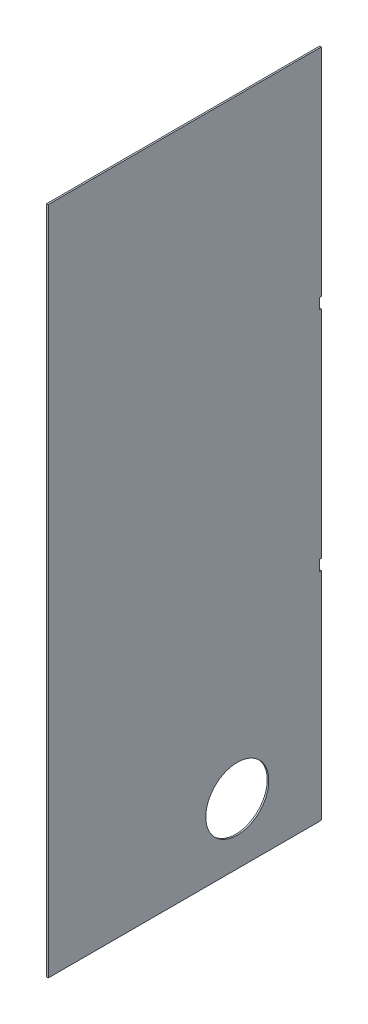
ISO-10303-21;
HEADER;
FILE_DESCRIPTION(('STEP AP214'),'2;1');
FILE_NAME('part.step','',(''),(''),'','','');
FILE_SCHEMA(('AUTOMOTIVE_DESIGN { 1 0 10303 214 1 1 1 1 }'));
ENDSEC;
DATA;
#1=APPLICATION_CONTEXT('core data for automotive mechanical design processes');
#2=APPLICATION_PROTOCOL_DEFINITION('international standard','automotive_design',2000,#1);
#3=PRODUCT_CONTEXT('',#1,'mechanical');
#4=PRODUCT('Part','Part','',(#3));
#5=PRODUCT_RELATED_PRODUCT_CATEGORY('part','',(#4));
#6=PRODUCT_DEFINITION_FORMATION('','',#4);
#7=PRODUCT_DEFINITION_CONTEXT('part definition',#1,'design');
#8=PRODUCT_DEFINITION('design','',#6,#7);
#9=PRODUCT_DEFINITION_SHAPE('','',#8);
#10=(LENGTH_UNIT() NAMED_UNIT(*) SI_UNIT(.MILLI.,.METRE.));
#11=(NAMED_UNIT(*) PLANE_ANGLE_UNIT() SI_UNIT($,.RADIAN.));
#12=(NAMED_UNIT(*) SI_UNIT($,.STERADIAN.) SOLID_ANGLE_UNIT());
#13=UNCERTAINTY_MEASURE_WITH_UNIT(LENGTH_MEASURE(1.E-05),#10,'distance_accuracy_value','');
#14=(GEOMETRIC_REPRESENTATION_CONTEXT(3) GLOBAL_UNCERTAINTY_ASSIGNED_CONTEXT((#13)) GLOBAL_UNIT_ASSIGNED_CONTEXT((#10,
#11,#12)) REPRESENTATION_CONTEXT('',''));
#15=CARTESIAN_POINT('',(0.,0.,0.));
#16=DIRECTION('',(0.,0.,1.));
#17=DIRECTION('',(1.,0.,0.));
#18=AXIS2_PLACEMENT_3D('',#15,#16,#17);
#19=CARTESIAN_POINT('',(-1158.,0.,-3.99680288865056E-12));
#20=DIRECTION('',(1.,0.,0.));
#21=DIRECTION('',(0.,0.,-1.));
#22=AXIS2_PLACEMENT_3D('',#19,#20,#21);
#23=PLANE('',#22);
#24=CARTESIAN_POINT('',(-1158.,-260.,78.5000000000003));
#25=DIRECTION('',(-1.,0.,0.));
#26=DIRECTION('',(0.,0.,1.));
#27=AXIS2_PLACEMENT_3D('',#24,#25,#26);
#28=CIRCLE('',#27,30.);
#29=CARTESIAN_POINT('',(-1158.,-260.,108.5));
#30=VERTEX_POINT('',#29);
#31=EDGE_CURVE('E261',#30,#30,#28,.T.);
#32=ORIENTED_EDGE('',*,*,#31,.F.);
#33=EDGE_LOOP('',(#32));
#34=FACE_BOUND('',#33,.T.);
#35=DIRECTION('',(0.,0.,-1.));
#36=VECTOR('',#35,1.);
#37=CARTESIAN_POINT('',(-1158.,114.217851130198,0.1));
#38=LINE('',#37,#36);
#39=CARTESIAN_POINT('',(-1158.,114.217851130198,0.1));
#40=VERTEX_POINT('',#39);
#41=CARTESIAN_POINT('',(-1158.,114.217851130198,-1.5));
#42=VERTEX_POINT('',#41);
#43=EDGE_CURVE('E157',#40,#42,#38,.T.);
#44=ORIENTED_EDGE('',*,*,#43,.F.);
#45=DIRECTION('',(0.,-1.,0.));
#46=VECTOR('',#45,1.);
#47=CARTESIAN_POINT('',(-1158.,114.217851130198,0.1));
#48=LINE('',#47,#46);
#49=CARTESIAN_POINT('',(-1158.,104.017851130198,0.1));
#50=VERTEX_POINT('',#49);
#51=EDGE_CURVE('E156',#40,#50,#48,.T.);
#52=ORIENTED_EDGE('',*,*,#51,.T.);
#53=DIRECTION('',(0.,0.,-1.));
#54=VECTOR('',#53,1.);
#55=CARTESIAN_POINT('',(-1158.,104.017851130198,0.1));
#56=LINE('',#55,#54);
#57=CARTESIAN_POINT('',(-1158.,104.017851130198,-1.5));
#58=VERTEX_POINT('',#57);
#59=EDGE_CURVE('E108',#50,#58,#56,.T.);
#60=ORIENTED_EDGE('',*,*,#59,.T.);
#61=DIRECTION('',(0.,1.,0.));
#62=VECTOR('',#61,1.);
#63=CARTESIAN_POINT('',(-1158.,0.,-1.5));
#64=LINE('',#63,#62);
#65=CARTESIAN_POINT('',(-1158.,-101.664297739604,-1.5));
#66=VERTEX_POINT('',#65);
#67=EDGE_CURVE('E155',#66,#58,#64,.T.);
#68=ORIENTED_EDGE('',*,*,#67,.F.);
#69=DIRECTION('',(0.,0.,-1.));
#70=VECTOR('',#69,1.);
#71=CARTESIAN_POINT('',(-1158.,-101.664297739604,0.1));
#72=LINE('',#71,#70);
#73=CARTESIAN_POINT('',(-1158.,-101.664297739604,0.1));
#74=VERTEX_POINT('',#73);
#75=EDGE_CURVE('E172',#74,#66,#72,.T.);
#76=ORIENTED_EDGE('',*,*,#75,.F.);
#77=DIRECTION('',(0.,-1.,0.));
#78=VECTOR('',#77,1.);
#79=CARTESIAN_POINT('',(-1158.,-101.664297739604,0.1));
#80=LINE('',#79,#78);
#81=CARTESIAN_POINT('',(-1158.,-111.864297739604,0.1));
#82=VERTEX_POINT('',#81);
#83=EDGE_CURVE('E175',#74,#82,#80,.T.);
#84=ORIENTED_EDGE('',*,*,#83,.T.);
#85=DIRECTION('',(0.,0.,-1.));
#86=VECTOR('',#85,1.);
#87=CARTESIAN_POINT('',(-1158.,-111.864297739604,0.1));
#88=LINE('',#87,#86);
#89=CARTESIAN_POINT('',(-1158.,-111.864297739604,-1.5));
#90=VERTEX_POINT('',#89);
#91=EDGE_CURVE('E174',#82,#90,#88,.T.);
#92=ORIENTED_EDGE('',*,*,#91,.T.);
#93=DIRECTION('',(0.,1.,0.));
#94=VECTOR('',#93,1.);
#95=CARTESIAN_POINT('',(-1158.,0.,-1.5));
#96=LINE('',#95,#94);
#97=CARTESIAN_POINT('',(-1158.,-317.646446609407,-1.5));
#98=VERTEX_POINT('',#97);
#99=EDGE_CURVE('E162',#98,#90,#96,.T.);
#100=ORIENTED_EDGE('',*,*,#99,.F.);
#101=CARTESIAN_POINT('',(-1158.,-317.792893218813,0.99999999999989));
#102=CARTESIAN_POINT('',(-1158.,-317.785944806708,0.906875573864438));
#103=CARTESIAN_POINT('',(-1158.,-317.779001364591,0.813750666015281));
#104=CARTESIAN_POINT('',(-1158.,-317.765281159909,0.627487483074199));
#105=CARTESIAN_POINT('',(-1158.,-317.758504399368,0.534349207833735));
#106=CARTESIAN_POINT('',(-1158.,-317.738660880625,0.254918404198879));
#107=CARTESIAN_POINT('',(-1158.,-317.726079381561,0.0685906193618217));
#108=CARTESIAN_POINT('',(-1158.,-317.70018630794,-0.347993530090893));
#109=CARTESIAN_POINT('',(-1158.,-317.687397996636,-0.578283009927433));
#110=CARTESIAN_POINT('',(-1158.,-317.670470206659,-0.923839383549297));
#111=CARTESIAN_POINT('',(-1158.,-317.665203124078,-1.03905259168911));
#112=CARTESIAN_POINT('',(-1158.,-317.655340926057,-1.26950688956674));
#113=CARTESIAN_POINT('',(-1157.99999999999,-317.650745805069,-1.38474797906652));
#114=CARTESIAN_POINT('',(-1157.99999999996,-317.646446609406,-1.49999999999995));
#115=B_SPLINE_CURVE_WITH_KNOTS('',3,(#101,#102,#103,#104,#105,#106,#107,#108,#109,#110,#111,
#112,#113,#114),.UNSPECIFIED.,.F.,.F.,(4,2,2,2,2,2,4),(0.,0.280150009181361,0.560303419020726,
1.12055222826986,1.81246142168643,2.15846039154729,2.50445650482576),.UNSPECIFIED.);
#116=CARTESIAN_POINT('',(-1158.,-317.792893218813,0.99999999999989));
#117=VERTEX_POINT('',#116);
#118=EDGE_CURVE('E182',#117,#98,#115,.T.);
#119=ORIENTED_EDGE('',*,*,#118,.F.);
#120=DIRECTION('',(0.,0.,-1.));
#121=VECTOR('',#120,1.);
#122=CARTESIAN_POINT('',(-1158.,-317.792893218813,-3.99680288865056E-12));
#123=LINE('',#122,#121);
#124=CARTESIAN_POINT('',(-1158.,-317.792893218813,258.5));
#125=VERTEX_POINT('',#124);
#126=EDGE_CURVE('E193',#125,#117,#123,.T.);
#127=ORIENTED_EDGE('',*,*,#126,.F.);
#128=DIRECTION('',(0.,1.,0.));
#129=VECTOR('',#128,1.);
#130=CARTESIAN_POINT('',(-1158.,0.,258.5));
#131=LINE('',#130,#129);
#132=CARTESIAN_POINT('',(-1158.,320.,258.5));
#133=VERTEX_POINT('',#132);
#134=EDGE_CURVE('E251',#133,#125,#131,.F.);
#135=ORIENTED_EDGE('',*,*,#134,.F.);
#136=DIRECTION('',(0.,0.,1.));
#137=VECTOR('',#136,1.);
#138=CARTESIAN_POINT('',(-1158.,320.,-1.5));
#139=LINE('',#138,#137);
#140=CARTESIAN_POINT('',(-1158.,320.,-1.5));
#141=VERTEX_POINT('',#140);
#142=EDGE_CURVE('E166',#141,#133,#139,.T.);
#143=ORIENTED_EDGE('',*,*,#142,.F.);
#144=DIRECTION('',(0.,1.,0.));
#145=VECTOR('',#144,1.);
#146=CARTESIAN_POINT('',(-1158.,0.,-1.5));
#147=LINE('',#146,#145);
#148=EDGE_CURVE('E163',#42,#141,#147,.T.);
#149=ORIENTED_EDGE('',*,*,#148,.F.);
#150=EDGE_LOOP('',(#44,#52,#60,#68,#76,#84,#92,#100,#119,#127,#135,#143,#149));
#151=FACE_BOUND('',#150,.T.);
#152=ADVANCED_FACE('F40',(#34,#151),#23,.F.);
#153=CARTESIAN_POINT('',(2.,0.,-1.5));
#154=DIRECTION('',(0.,0.,-1.));
#155=DIRECTION('',(-1.,0.,0.));
#156=AXIS2_PLACEMENT_3D('',#153,#154,#155);
#157=PLANE('',#156);
#158=DIRECTION('',(0.,-1.,0.));
#159=VECTOR('',#158,1.);
#160=CARTESIAN_POINT('',(-1156.5,0.,-1.5));
#161=LINE('',#160,#159);
#162=CARTESIAN_POINT('',(-1156.5,320.,-1.5));
#163=VERTEX_POINT('',#162);
#164=CARTESIAN_POINT('',(-1156.5,114.217851130198,-1.5));
#165=VERTEX_POINT('',#164);
#166=EDGE_CURVE('E11',#163,#165,#161,.T.);
#167=ORIENTED_EDGE('',*,*,#166,.T.);
#168=DIRECTION('',(-1.,0.,0.));
#169=VECTOR('',#168,1.);
#170=CARTESIAN_POINT('',(2.,114.217851130198,-1.5));
#171=LINE('',#170,#169);
#172=EDGE_CURVE('E147',#165,#42,#171,.T.);
#173=ORIENTED_EDGE('',*,*,#172,.T.);
#174=ORIENTED_EDGE('',*,*,#148,.T.);
#175=DIRECTION('',(-1.,0.,0.));
#176=VECTOR('',#175,1.);
#177=CARTESIAN_POINT('',(2.,320.,-1.5));
#178=LINE('',#177,#176);
#179=EDGE_CURVE('E223',#141,#163,#178,.F.);
#180=ORIENTED_EDGE('',*,*,#179,.T.);
#181=EDGE_LOOP('',(#167,#173,#174,#180));
#182=FACE_BOUND('',#181,.T.);
#183=ADVANCED_FACE('F202',(#182),#157,.T.);
#184=ORIENTED_EDGE('',*,*,#67,.T.);
#185=DIRECTION('',(1.,0.,0.));
#186=VECTOR('',#185,1.);
#187=CARTESIAN_POINT('',(2.,104.017851130198,-1.5));
#188=LINE('',#187,#186);
#189=CARTESIAN_POINT('',(-1156.5,104.017851130198,-1.5));
#190=VERTEX_POINT('',#189);
#191=EDGE_CURVE('E139',#58,#190,#188,.T.);
#192=ORIENTED_EDGE('',*,*,#191,.T.);
#193=DIRECTION('',(0.,-1.,0.));
#194=VECTOR('',#193,1.);
#195=CARTESIAN_POINT('',(-1156.5,0.,-1.5));
#196=LINE('',#195,#194);
#197=CARTESIAN_POINT('',(-1156.5,-101.664297739604,-1.5));
#198=VERTEX_POINT('',#197);
#199=EDGE_CURVE('E49',#190,#198,#196,.T.);
#200=ORIENTED_EDGE('',*,*,#199,.T.);
#201=DIRECTION('',(-1.,0.,0.));
#202=VECTOR('',#201,1.);
#203=CARTESIAN_POINT('',(2.,-101.664297739604,-1.5));
#204=LINE('',#203,#202);
#205=EDGE_CURVE('E148',#198,#66,#204,.T.);
#206=ORIENTED_EDGE('',*,*,#205,.T.);
#207=EDGE_LOOP('',(#184,#192,#200,#206));
#208=FACE_BOUND('',#207,.T.);
#209=ADVANCED_FACE('F160',(#208),#157,.T.);
#210=ORIENTED_EDGE('',*,*,#99,.T.);
#211=DIRECTION('',(1.,0.,0.));
#212=VECTOR('',#211,1.);
#213=CARTESIAN_POINT('',(2.,-111.864297739604,-1.5));
#214=LINE('',#213,#212);
#215=CARTESIAN_POINT('',(-1156.5,-111.864297739604,-1.5));
#216=VERTEX_POINT('',#215);
#217=EDGE_CURVE('E238',#90,#216,#214,.T.);
#218=ORIENTED_EDGE('',*,*,#217,.T.);
#219=DIRECTION('',(0.,-1.,0.));
#220=VECTOR('',#219,1.);
#221=CARTESIAN_POINT('',(-1156.5,0.,-1.5));
#222=LINE('',#221,#220);
#223=CARTESIAN_POINT('',(-1156.5,-317.570949809759,-1.5));
#224=VERTEX_POINT('',#223);
#225=EDGE_CURVE('E191',#216,#224,#222,.T.);
#226=ORIENTED_EDGE('',*,*,#225,.T.);
#227=CARTESIAN_POINT('',(-1155.5,-317.5,-1.5));
#228=CARTESIAN_POINT('',(-1155.59312094687,-317.506950071026,-1.49999999999996));
#229=CARTESIAN_POINT('',(-1155.686242734,-317.513892321386,-1.49999999999998));
#230=CARTESIAN_POINT('',(-1155.87249959806,-317.52761015388,-1.50000000000002));
#231=CARTESIAN_POINT('',(-1155.96563467514,-317.534385734126,-1.50000000000004));
#232=CARTESIAN_POINT('',(-1156.15192500746,-317.547618849673,-1.49999999999996));
#233=CARTESIAN_POINT('',(-1156.24508026207,-317.554076393891,-1.49999999999986));
#234=CARTESIAN_POINT('',(-1156.43141858807,-317.566570716482,-1.50000000000015));
#235=CARTESIAN_POINT('',(-1156.52460165935,-317.572607496693,-1.50000000000054));
#236=CARTESIAN_POINT('',(-1156.80420826893,-317.58998294894,-1.50000000000097));
#237=CARTESIAN_POINT('',(-1156.99067826483,-317.600585937227,-1.50000000000026));
#238=CARTESIAN_POINT('',(-1157.36372426809,-317.619779662149,-1.49999999999974));
#239=CARTESIAN_POINT('',(-1157.55030027728,-317.62837036304,-1.49999999999994));
#240=CARTESIAN_POINT('',(-1157.92353070576,-317.643831643858,-1.50000000000008));
#241=CARTESIAN_POINT('',(-1158.11018512814,-317.650702148313,-1.50000000000002));
#242=CARTESIAN_POINT('',(-1158.48354131926,-317.663070364639,-1.49999999999998));
#243=CARTESIAN_POINT('',(-1158.67024308864,-317.668568056818,-1.5));
#244=CARTESIAN_POINT('',(-1159.04367121994,-317.678505575859,-1.50000000000001));
#245=CARTESIAN_POINT('',(-1159.23039758144,-317.682945419222,-1.5));
#246=CARTESIAN_POINT('',(-1159.60386196896,-317.691001185622,-1.5));
#247=CARTESIAN_POINT('',(-1159.79059999438,-317.694617136349,-1.49999999999999));
#248=CARTESIAN_POINT('',(-1159.97734220893,-317.697938195438,-1.5));
#249=B_SPLINE_CURVE_WITH_KNOTS('',3,(#227,#228,#229,#230,#231,#232,#233,#234,#235,#236,#237,
#238,#239,#240,#241,#242,#243,#244,#245,#246,#247,#248),.UNSPECIFIED.,.F.,.F.,(4,2,2,2,2,2,2,2,
2,2,4),(0.,0.280140261513009,0.560283694471909,0.840419268635176,1.12055361889905,
1.68085521907857,2.24116677096453,2.80150290139697,3.36184706900189,3.92218249502572,
4.48249908576905),.UNSPECIFIED.);
#250=EDGE_CURVE('E192',#224,#98,#249,.T.);
#251=ORIENTED_EDGE('',*,*,#250,.T.);
#252=EDGE_LOOP('',(#210,#218,#226,#251));
#253=FACE_BOUND('',#252,.T.);
#254=ADVANCED_FACE('F209',(#253),#157,.T.);
#255=CARTESIAN_POINT('',(-1156.5,0.,-3.99680288865056E-12));
#256=DIRECTION('',(1.,0.,0.));
#257=DIRECTION('',(0.,0.,-1.));
#258=AXIS2_PLACEMENT_3D('',#255,#256,#257);
#259=PLANE('',#258);
#260=CARTESIAN_POINT('',(-1156.5,-260.,78.5000000000003));
#261=DIRECTION('',(-1.,0.,0.));
#262=DIRECTION('',(0.,0.,1.));
#263=AXIS2_PLACEMENT_3D('',#260,#261,#262);
#264=CIRCLE('',#263,30.);
#265=CARTESIAN_POINT('',(-1156.5,-260.,108.5));
#266=VERTEX_POINT('',#265);
#267=EDGE_CURVE('E168',#266,#266,#264,.T.);
#268=ORIENTED_EDGE('',*,*,#267,.T.);
#269=EDGE_LOOP('',(#268));
#270=FACE_BOUND('',#269,.T.);
#271=DIRECTION('',(0.,1.,0.));
#272=VECTOR('',#271,1.);
#273=CARTESIAN_POINT('',(-1156.5,114.217851130198,0.1));
#274=LINE('',#273,#272);
#275=CARTESIAN_POINT('',(-1156.5,104.017851130198,0.1));
#276=VERTEX_POINT('',#275);
#277=CARTESIAN_POINT('',(-1156.5,114.217851130198,0.1));
#278=VERTEX_POINT('',#277);
#279=EDGE_CURVE('E255',#276,#278,#274,.T.);
#280=ORIENTED_EDGE('',*,*,#279,.T.);
#281=DIRECTION('',(0.,0.,-1.));
#282=VECTOR('',#281,1.);
#283=CARTESIAN_POINT('',(-1156.5,114.217851130198,0.1));
#284=LINE('',#283,#282);
#285=EDGE_CURVE('E235',#278,#165,#284,.T.);
#286=ORIENTED_EDGE('',*,*,#285,.T.);
#287=ORIENTED_EDGE('',*,*,#166,.F.);
#288=DIRECTION('',(0.,0.,1.));
#289=VECTOR('',#288,1.);
#290=CARTESIAN_POINT('',(-1156.5,320.,-1.5));
#291=LINE('',#290,#289);
#292=CARTESIAN_POINT('',(-1156.5,320.,258.5));
#293=VERTEX_POINT('',#292);
#294=EDGE_CURVE('E275',#293,#163,#291,.F.);
#295=ORIENTED_EDGE('',*,*,#294,.F.);
#296=DIRECTION('',(0.,1.,0.));
#297=VECTOR('',#296,1.);
#298=CARTESIAN_POINT('',(-1156.5,0.,258.5));
#299=LINE('',#298,#297);
#300=CARTESIAN_POINT('',(-1156.5,-317.792893218813,258.5));
#301=VERTEX_POINT('',#300);
#302=EDGE_CURVE('E263',#293,#301,#299,.F.);
#303=ORIENTED_EDGE('',*,*,#302,.T.);
#304=DIRECTION('',(0.,0.,-1.));
#305=VECTOR('',#304,1.);
#306=CARTESIAN_POINT('',(-1156.5,-317.792893218813,-3.99680288865056E-12));
#307=LINE('',#306,#305);
#308=CARTESIAN_POINT('',(-1156.5,-317.792893218813,0.99999999999989));
#309=VERTEX_POINT('',#308);
#310=EDGE_CURVE('E224',#301,#309,#307,.T.);
#311=ORIENTED_EDGE('',*,*,#310,.T.);
#312=CARTESIAN_POINT('',(-1156.5,-317.792893218813,0.99999999999989));
#313=CARTESIAN_POINT('',(-1156.5,-317.784324310594,0.954107345524168));
#314=CARTESIAN_POINT('',(-1156.5,-317.775774868725,0.908209343397016));
#315=CARTESIAN_POINT('',(-1156.5,-317.758973182692,0.816353274387673));
#316=CARTESIAN_POINT('',(-1156.5,-317.750720976188,0.770395200653299));
#317=CARTESIAN_POINT('',(-1156.5,-317.734773711387,0.678377669974552));
#318=CARTESIAN_POINT('',(-1156.5,-317.727078695715,0.632318205550604));
#319=CARTESIAN_POINT('',(-1156.5,-317.712394009144,0.540089434507695));
#320=CARTESIAN_POINT('',(-1156.5,-317.7054043001,0.493920133967094));
#321=CARTESIAN_POINT('',(-1156.5,-317.685591894446,0.355204284173344));
#322=CARTESIAN_POINT('',(-1156.5,-317.673932887523,0.262489105625886));
#323=CARTESIAN_POINT('',(-1156.5,-317.653420709721,0.076744359703075));
#324=CARTESIAN_POINT('',(-1156.5,-317.644567897407,-0.0162852463150045));
#325=CARTESIAN_POINT('',(-1156.5,-317.629527436083,-0.196218365629621));
#326=CARTESIAN_POINT('',(-1156.5,-317.623199995365,-0.28311051955664));
#327=CARTESIAN_POINT('',(-1156.5,-317.61193264173,-0.456982063399841));
#328=CARTESIAN_POINT('',(-1156.5,-317.606992721403,-0.543961452847695));
#329=CARTESIAN_POINT('',(-1156.5,-317.595021866583,-0.778820249144738));
#330=CARTESIAN_POINT('',(-1156.5,-317.588944794482,-0.926747462982488));
#331=CARTESIAN_POINT('',(-1156.5,-317.581150070539,-1.14866590915876));
#332=CARTESIAN_POINT('',(-1156.5,-317.578772136064,-1.2226364602288));
#333=CARTESIAN_POINT('',(-1156.5,-317.574375150827,-1.37058561322924));
#334=CARTESIAN_POINT('',(-1156.5,-317.572356087074,-1.44456421477121));
#335=CARTESIAN_POINT('',(-1156.5,-317.570475833564,-1.51854665494297));
#336=B_SPLINE_CURVE_WITH_KNOTS('',3,(#312,#313,#314,#315,#316,#317,#318,#319,#320,#321,#322,
#323,#324,#325,#326,#327,#328,#329,#330,#331,#332,#333,#334,#335),.UNSPECIFIED.,.F.,.F.,(4,2,2,
2,2,2,2,2,2,2,2,4),(0.,0.140060135170638,0.28013795460448,0.420226479179164,0.560307423635897,
0.840589045764591,1.12090646680559,1.38225878928862,1.64360971612221,2.08774430159457,
2.30977037325064,2.53178840633685),.UNSPECIFIED.);
#337=EDGE_CURVE('E215',#309,#224,#336,.T.);
#338=ORIENTED_EDGE('',*,*,#337,.T.);
#339=ORIENTED_EDGE('',*,*,#225,.F.);
#340=DIRECTION('',(0.,0.,-1.));
#341=VECTOR('',#340,1.);
#342=CARTESIAN_POINT('',(-1156.5,-111.864297739604,0.1));
#343=LINE('',#342,#341);
#344=CARTESIAN_POINT('',(-1156.5,-111.864297739604,0.1));
#345=VERTEX_POINT('',#344);
#346=EDGE_CURVE('E180',#345,#216,#343,.T.);
#347=ORIENTED_EDGE('',*,*,#346,.F.);
#348=DIRECTION('',(0.,1.,0.));
#349=VECTOR('',#348,1.);
#350=CARTESIAN_POINT('',(-1156.5,-101.664297739604,0.1));
#351=LINE('',#350,#349);
#352=CARTESIAN_POINT('',(-1156.5,-101.664297739604,0.1));
#353=VERTEX_POINT('',#352);
#354=EDGE_CURVE('E229',#345,#353,#351,.T.);
#355=ORIENTED_EDGE('',*,*,#354,.T.);
#356=DIRECTION('',(0.,0.,-1.));
#357=VECTOR('',#356,1.);
#358=CARTESIAN_POINT('',(-1156.5,-101.664297739604,0.1));
#359=LINE('',#358,#357);
#360=EDGE_CURVE('E228',#353,#198,#359,.T.);
#361=ORIENTED_EDGE('',*,*,#360,.T.);
#362=ORIENTED_EDGE('',*,*,#199,.F.);
#363=DIRECTION('',(0.,0.,-1.));
#364=VECTOR('',#363,1.);
#365=CARTESIAN_POINT('',(-1156.5,104.017851130198,0.1));
#366=LINE('',#365,#364);
#367=EDGE_CURVE('E142',#276,#190,#366,.T.);
#368=ORIENTED_EDGE('',*,*,#367,.F.);
#369=EDGE_LOOP('',(#280,#286,#287,#295,#303,#311,#338,#339,#347,#355,#361,#362,#368));
#370=FACE_BOUND('',#369,.T.);
#371=ADVANCED_FACE('F204',(#270,#370),#259,.T.);
#372=CARTESIAN_POINT('',(-1156.5,-317.792893218813,0.));
#373=DIRECTION('',(0.,1.,0.));
#374=DIRECTION('',(0.,0.,1.));
#375=AXIS2_PLACEMENT_3D('',#372,#373,#374);
#376=PLANE('',#375);
#377=DIRECTION('',(1.,0.,0.));
#378=VECTOR('',#377,1.);
#379=CARTESIAN_POINT('',(-1157.249925,-317.792893218813,0.99999999999989));
#380=LINE('',#379,#378);
#381=EDGE_CURVE('E248',#117,#309,#380,.T.);
#382=ORIENTED_EDGE('',*,*,#381,.T.);
#383=ORIENTED_EDGE('',*,*,#310,.F.);
#384=DIRECTION('',(1.,0.,0.));
#385=VECTOR('',#384,1.);
#386=CARTESIAN_POINT('',(-1156.5,-317.792893218813,258.5));
#387=LINE('',#386,#385);
#388=EDGE_CURVE('E252',#125,#301,#387,.T.);
#389=ORIENTED_EDGE('',*,*,#388,.F.);
#390=ORIENTED_EDGE('',*,*,#126,.T.);
#391=EDGE_LOOP('',(#382,#383,#389,#390));
#392=FACE_BOUND('',#391,.T.);
#393=ADVANCED_FACE('F208',(#392),#376,.F.);
#394=CARTESIAN_POINT('',(-1158.,320.,258.5));
#395=DIRECTION('',(0.,0.,-1.));
#396=DIRECTION('',(-1.,0.,0.));
#397=AXIS2_PLACEMENT_3D('',#394,#395,#396);
#398=PLANE('',#397);
#399=ORIENTED_EDGE('',*,*,#302,.F.);
#400=DIRECTION('',(-1.,0.,0.));
#401=VECTOR('',#400,1.);
#402=CARTESIAN_POINT('',(-1158.,320.,258.5));
#403=LINE('',#402,#401);
#404=EDGE_CURVE('E254',#133,#293,#403,.F.);
#405=ORIENTED_EDGE('',*,*,#404,.F.);
#406=ORIENTED_EDGE('',*,*,#134,.T.);
#407=ORIENTED_EDGE('',*,*,#388,.T.);
#408=EDGE_LOOP('',(#399,#405,#406,#407));
#409=FACE_BOUND('',#408,.T.);
#410=ADVANCED_FACE('F321',(#409),#398,.F.);
#411=CARTESIAN_POINT('',(-1159.05074710938,-317.792893218813,0.99999999999989));
#412=CARTESIAN_POINT('',(-1159.05074710938,-317.768480987746,0.535124489156894));
#413=CARTESIAN_POINT('',(-1158.95833066629,-317.744077682344,0.0705994562272496));
#414=CARTESIAN_POINT('',(-1158.60259449266,-317.695262145876,-0.788223638775432));
#415=CARTESIAN_POINT('',(-1158.33941472911,-317.670854377641,-1.18209998952237));
#416=CARTESIAN_POINT('',(-1157.68209998952,-317.622038841172,-1.83941472910355));
#417=CARTESIAN_POINT('',(-1157.28822363877,-317.597631072938,-2.1025944926553));
#418=CARTESIAN_POINT('',(-1156.42940054377,-317.548815536469,-2.45833066628444));
#419=CARTESIAN_POINT('',(-1155.96487551084,-317.524412231068,-2.55074710936911));
#420=CARTESIAN_POINT('',(-1155.5,-317.5,-2.55074710936911));
#421=CARTESIAN_POINT('',(-1158.015,-317.792893218813,0.99999999999989));
#422=CARTESIAN_POINT('',(-1158.015,-317.768481073034,0.670728235423301));
#423=CARTESIAN_POINT('',(-1157.94954128182,-317.744077682344,0.341704070836363));
#424=CARTESIAN_POINT('',(-1157.69757276671,-317.695262145876,-0.26660173563281));
#425=CARTESIAN_POINT('',(-1157.51116210863,-317.670854377641,-0.54558500073687));
#426=CARTESIAN_POINT('',(-1157.04558500074,-317.622038841172,-1.01116210863136));
#427=CARTESIAN_POINT('',(-1156.76660173563,-317.597631072938,-1.19757276671098));
#428=CARTESIAN_POINT('',(-1156.15829592916,-317.548815536469,-1.44954128182082));
#429=CARTESIAN_POINT('',(-1155.82927176458,-317.524412145779,-1.51499999999999));
#430=CARTESIAN_POINT('',(-1155.5,-317.5,-1.51499999999999));
#431=CARTESIAN_POINT('',(-1158.,-317.792893218813,0.99999999999989));
#432=CARTESIAN_POINT('',(-1158.,-317.76848107427,0.672692089510457));
#433=CARTESIAN_POINT('',(-1157.93493169167,-317.744077682344,0.345630289101756));
#434=CARTESIAN_POINT('',(-1157.68446597089,-317.695262145876,-0.259047450927252));
#435=CARTESIAN_POINT('',(-1157.499167106,-317.670854377641,-0.536366799937266));
#436=CARTESIAN_POINT('',(-1157.03636679994,-317.622038841172,-0.999167105995402));
#437=CARTESIAN_POINT('',(-1156.75904745093,-317.597631072938,-1.18446597088567));
#438=CARTESIAN_POINT('',(-1156.1543697109,-317.548815536469,-1.4349316916708));
#439=CARTESIAN_POINT('',(-1155.82730791049,-317.524412144544,-1.5));
#440=CARTESIAN_POINT('',(-1155.5,-317.5,-1.5));
#441=CARTESIAN_POINT('',(-1156.5,-317.792893218813,0.99999999999989));
#442=CARTESIAN_POINT('',(-1156.5,-317.768481197786,0.869077498224652));
#443=CARTESIAN_POINT('',(-1156.47397267667,-317.744077682344,0.738252115640631));
#444=CARTESIAN_POINT('',(-1156.37378638835,-317.695262145876,0.496381019629039));
#445=CARTESIAN_POINT('',(-1156.2996668424,-317.670854377641,0.385453280025039));
#446=CARTESIAN_POINT('',(-1156.11454671997,-317.622038841172,0.20033315760179));
#447=CARTESIAN_POINT('',(-1156.00361898037,-317.597631072938,0.12621361164572));
#448=CARTESIAN_POINT('',(-1155.76174788436,-317.548815536469,0.0260273233316788));
#449=CARTESIAN_POINT('',(-1155.63092250178,-317.524412021028,0.));
#450=CARTESIAN_POINT('',(-1155.5,-317.5,0.));
#451=CARTESIAN_POINT('',(-1156.48485,-317.792893218813,0.99999999999989));
#452=CARTESIAN_POINT('',(-1156.48485,-317.768481199033,0.871060990852657));
#453=CARTESIAN_POINT('',(-1156.45921699062,-317.744077682344,0.742217596088696));
#454=CARTESIAN_POINT('',(-1156.36054852457,-317.695262145876,0.504010847181657));
#455=CARTESIAN_POINT('',(-1156.28755188974,-317.670854377641,0.39476366283267));
#456=CARTESIAN_POINT('',(-1156.10523633717,-317.622038841172,0.212448110264135));
#457=CARTESIAN_POINT('',(-1155.99598915282,-317.597631072938,0.139451475429292));
#458=CARTESIAN_POINT('',(-1155.75778240391,-317.548815536469,0.0407830093832051));
#459=CARTESIAN_POINT('',(-1155.62893900915,-317.52441201978,0.0151499999999916));
#460=CARTESIAN_POINT('',(-1155.5,-317.5,0.0151499999999916));
#461=CARTESIAN_POINT('',(-1155.79289321881,-317.792893218813,0.99999999999989));
#462=CARTESIAN_POINT('',(-1155.79289321881,-317.768481256011,0.961654467709069));
#463=CARTESIAN_POINT('',(-1155.78526999233,-317.744077682344,0.92333581963242));
#464=CARTESIAN_POINT('',(-1155.75592610784,-317.695262145876,0.852493415781793));
#465=CARTESIAN_POINT('',(-1155.73421699545,-317.670854377641,0.82000343307365));
#466=CARTESIAN_POINT('',(-1155.67999656693,-317.622038841172,0.765783004549411));
#467=CARTESIAN_POINT('',(-1155.64750658424,-317.597631072938,0.744073892156709));
#468=CARTESIAN_POINT('',(-1155.57666418037,-317.548815536469,0.714730007690943));
#469=CARTESIAN_POINT('',(-1155.53834553229,-317.524411962802,0.707106781182686));
#470=CARTESIAN_POINT('',(-1155.5,-317.5,0.707106781182686));
#471=B_SPLINE_SURFACE_WITH_KNOTS('',1,3,((#411,#412,#413,#414,#415,#416,#417,#418,#419,#420),
(#421,#422,#423,#424,#425,#426,#427,#428,#429,#430),(#431,#432,#433,#434,#435,#436,#437,#438,
#439,#440),(#441,#442,#443,#444,#445,#446,#447,#448,#449,#450),(#451,#452,#453,#454,#455,#456,
#457,#458,#459,#460),(#461,#462,#463,#464,#465,#466,#467,#468,#469,#470)),.UNSPECIFIED.,.F.,.F.,
.F.,(2,1,1,1,1,2),(4,2,2,2,4),(-0.700498072913335,-0.01,0.,1.,1.0101,1.47140452078872),(0.,0.25,
0.5,0.75,1.),.UNSPECIFIED.);
#472=ORIENTED_EDGE('',*,*,#250,.F.);
#473=ORIENTED_EDGE('',*,*,#337,.F.);
#474=ORIENTED_EDGE('',*,*,#381,.F.);
#475=ORIENTED_EDGE('',*,*,#118,.T.);
#476=EDGE_LOOP('',(#472,#473,#474,#475));
#477=FACE_BOUND('',#476,.T.);
#478=ADVANCED_FACE('F195',(#477),#471,.F.);
#479=CARTESIAN_POINT('',(-1158.,320.,-1.5));
#480=DIRECTION('',(0.,1.,0.));
#481=DIRECTION('',(0.,0.,1.));
#482=AXIS2_PLACEMENT_3D('',#479,#480,#481);
#483=PLANE('',#482);
#484=ORIENTED_EDGE('',*,*,#294,.T.);
#485=ORIENTED_EDGE('',*,*,#179,.F.);
#486=ORIENTED_EDGE('',*,*,#142,.T.);
#487=ORIENTED_EDGE('',*,*,#404,.T.);
#488=EDGE_LOOP('',(#484,#485,#486,#487));
#489=FACE_BOUND('',#488,.T.);
#490=ADVANCED_FACE('F289',(#489),#483,.T.);
#491=CARTESIAN_POINT('',(-1148.,-260.,78.5000000000004));
#492=DIRECTION('',(-1.,0.,0.));
#493=DIRECTION('',(0.,0.,1.));
#494=AXIS2_PLACEMENT_3D('',#491,#492,#493);
#495=CYLINDRICAL_SURFACE('',#494,30.);
#496=ORIENTED_EDGE('',*,*,#31,.T.);
#497=EDGE_LOOP('',(#496));
#498=FACE_BOUND('',#497,.T.);
#499=ORIENTED_EDGE('',*,*,#267,.F.);
#500=EDGE_LOOP('',(#499));
#501=FACE_BOUND('',#500,.T.);
#502=ADVANCED_FACE('F211',(#498,#501),#495,.F.);
#503=CARTESIAN_POINT('',(-1156.5,-101.664297739604,0.1));
#504=DIRECTION('',(0.,-1.,0.));
#505=DIRECTION('',(0.,0.,-1.));
#506=AXIS2_PLACEMENT_3D('',#503,#504,#505);
#507=PLANE('',#506);
#508=ORIENTED_EDGE('',*,*,#360,.F.);
#509=DIRECTION('',(-1.,0.,0.));
#510=VECTOR('',#509,1.);
#511=CARTESIAN_POINT('',(-1156.5,-101.664297739604,0.1));
#512=LINE('',#511,#510);
#513=EDGE_CURVE('E65',#353,#74,#512,.T.);
#514=ORIENTED_EDGE('',*,*,#513,.T.);
#515=ORIENTED_EDGE('',*,*,#75,.T.);
#516=ORIENTED_EDGE('',*,*,#205,.F.);
#517=EDGE_LOOP('',(#508,#514,#515,#516));
#518=FACE_BOUND('',#517,.T.);
#519=ADVANCED_FACE('F312',(#518),#507,.T.);
#520=CARTESIAN_POINT('',(-1156.5,-111.864297739604,0.1));
#521=DIRECTION('',(0.,1.,0.));
#522=DIRECTION('',(0.,0.,1.));
#523=AXIS2_PLACEMENT_3D('',#520,#521,#522);
#524=PLANE('',#523);
#525=ORIENTED_EDGE('',*,*,#91,.F.);
#526=DIRECTION('',(1.,0.,0.));
#527=VECTOR('',#526,1.);
#528=CARTESIAN_POINT('',(-1156.5,-111.864297739604,0.1));
#529=LINE('',#528,#527);
#530=EDGE_CURVE('E178',#82,#345,#529,.T.);
#531=ORIENTED_EDGE('',*,*,#530,.T.);
#532=ORIENTED_EDGE('',*,*,#346,.T.);
#533=ORIENTED_EDGE('',*,*,#217,.F.);
#534=EDGE_LOOP('',(#525,#531,#532,#533));
#535=FACE_BOUND('',#534,.T.);
#536=ADVANCED_FACE('F309',(#535),#524,.T.);
#537=CARTESIAN_POINT('',(2.,0.,0.1));
#538=DIRECTION('',(0.,0.,1.));
#539=DIRECTION('',(1.,0.,0.));
#540=AXIS2_PLACEMENT_3D('',#537,#538,#539);
#541=PLANE('',#540);
#542=ORIENTED_EDGE('',*,*,#513,.F.);
#543=ORIENTED_EDGE('',*,*,#354,.F.);
#544=ORIENTED_EDGE('',*,*,#530,.F.);
#545=ORIENTED_EDGE('',*,*,#83,.F.);
#546=EDGE_LOOP('',(#542,#543,#544,#545));
#547=FACE_BOUND('',#546,.T.);
#548=ADVANCED_FACE('F304',(#547),#541,.F.);
#549=CARTESIAN_POINT('',(-1156.5,114.217851130198,0.1));
#550=DIRECTION('',(0.,-1.,0.));
#551=DIRECTION('',(0.,0.,-1.));
#552=AXIS2_PLACEMENT_3D('',#549,#550,#551);
#553=PLANE('',#552);
#554=ORIENTED_EDGE('',*,*,#285,.F.);
#555=DIRECTION('',(-1.,0.,0.));
#556=VECTOR('',#555,1.);
#557=CARTESIAN_POINT('',(-1156.5,114.217851130198,0.1));
#558=LINE('',#557,#556);
#559=EDGE_CURVE('E44',#278,#40,#558,.T.);
#560=ORIENTED_EDGE('',*,*,#559,.T.);
#561=ORIENTED_EDGE('',*,*,#43,.T.);
#562=ORIENTED_EDGE('',*,*,#172,.F.);
#563=EDGE_LOOP('',(#554,#560,#561,#562));
#564=FACE_BOUND('',#563,.T.);
#565=ADVANCED_FACE('F296',(#564),#553,.T.);
#566=CARTESIAN_POINT('',(-1156.5,104.017851130198,0.1));
#567=DIRECTION('',(0.,1.,0.));
#568=DIRECTION('',(0.,0.,1.));
#569=AXIS2_PLACEMENT_3D('',#566,#567,#568);
#570=PLANE('',#569);
#571=ORIENTED_EDGE('',*,*,#59,.F.);
#572=DIRECTION('',(1.,0.,0.));
#573=VECTOR('',#572,1.);
#574=CARTESIAN_POINT('',(-1156.5,104.017851130198,0.1));
#575=LINE('',#574,#573);
#576=EDGE_CURVE('E104',#50,#276,#575,.T.);
#577=ORIENTED_EDGE('',*,*,#576,.T.);
#578=ORIENTED_EDGE('',*,*,#367,.T.);
#579=ORIENTED_EDGE('',*,*,#191,.F.);
#580=EDGE_LOOP('',(#571,#577,#578,#579));
#581=FACE_BOUND('',#580,.T.);
#582=ADVANCED_FACE('F140',(#581),#570,.T.);
#583=CARTESIAN_POINT('',(2.,0.,0.1));
#584=DIRECTION('',(0.,0.,1.));
#585=DIRECTION('',(1.,0.,0.));
#586=AXIS2_PLACEMENT_3D('',#583,#584,#585);
#587=PLANE('',#586);
#588=ORIENTED_EDGE('',*,*,#559,.F.);
#589=ORIENTED_EDGE('',*,*,#279,.F.);
#590=ORIENTED_EDGE('',*,*,#576,.F.);
#591=ORIENTED_EDGE('',*,*,#51,.F.);
#592=EDGE_LOOP('',(#588,#589,#590,#591));
#593=FACE_BOUND('',#592,.T.);
#594=ADVANCED_FACE('F42',(#593),#587,.F.);
#595=CLOSED_SHELL('',(#152,#183,#209,#254,#371,#393,#410,#478,#490,#502,#519,#536,#548,#565,
#582,#594));
#596=MANIFOLD_SOLID_BREP('B2',#595);
#597=ADVANCED_BREP_SHAPE_REPRESENTATION('',(#18,#596),#14);
#598=SHAPE_DEFINITION_REPRESENTATION(#9,#597);
ENDSEC;
END-ISO-10303-21;
